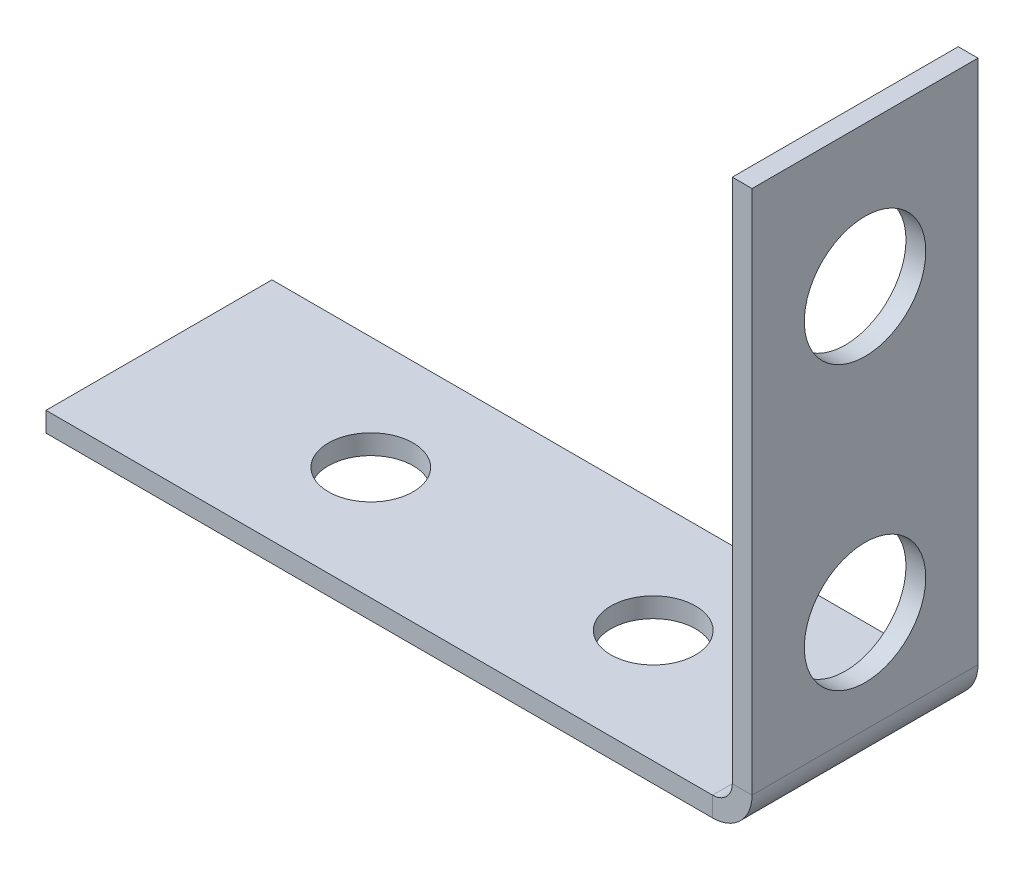
ISO-10303-21;
HEADER;
FILE_DESCRIPTION(('STEP AP214'),'2;1');
FILE_NAME('part.step','',(''),(''),'','','');
FILE_SCHEMA(('AUTOMOTIVE_DESIGN { 1 0 10303 214 1 1 1 1 }'));
ENDSEC;
DATA;
#1=APPLICATION_CONTEXT('core data for automotive mechanical design processes');
#2=APPLICATION_PROTOCOL_DEFINITION('international standard','automotive_design',2000,#1);
#3=PRODUCT_CONTEXT('',#1,'mechanical');
#4=PRODUCT('Part','Part','',(#3));
#5=PRODUCT_RELATED_PRODUCT_CATEGORY('part','',(#4));
#6=PRODUCT_DEFINITION_FORMATION('','',#4);
#7=PRODUCT_DEFINITION_CONTEXT('part definition',#1,'design');
#8=PRODUCT_DEFINITION('design','',#6,#7);
#9=PRODUCT_DEFINITION_SHAPE('','',#8);
#10=(LENGTH_UNIT() NAMED_UNIT(*) SI_UNIT(.MILLI.,.METRE.));
#11=(NAMED_UNIT(*) PLANE_ANGLE_UNIT() SI_UNIT($,.RADIAN.));
#12=(NAMED_UNIT(*) SI_UNIT($,.STERADIAN.) SOLID_ANGLE_UNIT());
#13=UNCERTAINTY_MEASURE_WITH_UNIT(LENGTH_MEASURE(1.E-05),#10,'distance_accuracy_value','');
#14=(GEOMETRIC_REPRESENTATION_CONTEXT(3) GLOBAL_UNCERTAINTY_ASSIGNED_CONTEXT((#13)) GLOBAL_UNIT_ASSIGNED_CONTEXT((#10,
#11,#12)) REPRESENTATION_CONTEXT('',''));
#15=CARTESIAN_POINT('',(0.,0.,0.));
#16=DIRECTION('',(0.,0.,1.));
#17=DIRECTION('',(1.,0.,0.));
#18=AXIS2_PLACEMENT_3D('',#15,#16,#17);
#19=CARTESIAN_POINT('',(23.6,0.,8.));
#20=DIRECTION('',(0.,0.,1.));
#21=DIRECTION('',(1.,0.,0.));
#22=AXIS2_PLACEMENT_3D('',#19,#20,#21);
#23=PLANE('',#22);
#24=DIRECTION('',(0.,1.,0.));
#25=VECTOR('',#24,1.);
#26=CARTESIAN_POINT('',(23.6,0.,8.));
#27=LINE('',#26,#25);
#28=CARTESIAN_POINT('',(23.6,0.,8.));
#29=VERTEX_POINT('',#28);
#30=CARTESIAN_POINT('',(23.6,0.7,8.));
#31=VERTEX_POINT('',#30);
#32=EDGE_CURVE('E11',#29,#31,#27,.T.);
#33=ORIENTED_EDGE('',*,*,#32,.F.);
#34=CARTESIAN_POINT('',(23.6,1.4,8.));
#35=DIRECTION('',(0.,0.,-1.));
#36=DIRECTION('',(-1.,0.,0.));
#37=AXIS2_PLACEMENT_3D('',#34,#35,#36);
#38=CIRCLE('',#37,1.4);
#39=CARTESIAN_POINT('',(25.,1.4,8.));
#40=VERTEX_POINT('',#39);
#41=EDGE_CURVE('E129',#29,#40,#38,.F.);
#42=ORIENTED_EDGE('',*,*,#41,.T.);
#43=DIRECTION('',(1.,0.,0.));
#44=VECTOR('',#43,1.);
#45=CARTESIAN_POINT('',(24.3,1.4,8.));
#46=LINE('',#45,#44);
#47=CARTESIAN_POINT('',(24.3,1.4,8.));
#48=VERTEX_POINT('',#47);
#49=EDGE_CURVE('E47',#48,#40,#46,.T.);
#50=ORIENTED_EDGE('',*,*,#49,.F.);
#51=CARTESIAN_POINT('',(23.6,1.4,8.));
#52=DIRECTION('',(0.,0.,1.));
#53=DIRECTION('',(1.,0.,0.));
#54=AXIS2_PLACEMENT_3D('',#51,#52,#53);
#55=CIRCLE('',#54,0.7);
#56=EDGE_CURVE('E136',#31,#48,#55,.T.);
#57=ORIENTED_EDGE('',*,*,#56,.F.);
#58=EDGE_LOOP('',(#33,#42,#50,#57));
#59=FACE_BOUND('',#58,.T.);
#60=ADVANCED_FACE('F39',(#59),#23,.T.);
#61=CARTESIAN_POINT('',(24.3,1.4,8.));
#62=DIRECTION('',(0.,0.,1.));
#63=DIRECTION('',(1.,0.,0.));
#64=AXIS2_PLACEMENT_3D('',#61,#62,#63);
#65=PLANE('',#64);
#66=DIRECTION('',(1.,0.,0.));
#67=VECTOR('',#66,1.);
#68=CARTESIAN_POINT('',(0.,0.,8.));
#69=LINE('',#68,#67);
#70=CARTESIAN_POINT('',(0.,0.,8.));
#71=VERTEX_POINT('',#70);
#72=EDGE_CURVE('E124',#71,#29,#69,.T.);
#73=ORIENTED_EDGE('',*,*,#72,.T.);
#74=ORIENTED_EDGE('',*,*,#32,.T.);
#75=DIRECTION('',(1.,0.,0.));
#76=VECTOR('',#75,1.);
#77=CARTESIAN_POINT('',(0.,0.7,8.));
#78=LINE('',#77,#76);
#79=CARTESIAN_POINT('',(0.,0.7,8.));
#80=VERTEX_POINT('',#79);
#81=EDGE_CURVE('E134',#80,#31,#78,.T.);
#82=ORIENTED_EDGE('',*,*,#81,.F.);
#83=DIRECTION('',(0.,1.,0.));
#84=VECTOR('',#83,1.);
#85=CARTESIAN_POINT('',(0.,0.,8.));
#86=LINE('',#85,#84);
#87=EDGE_CURVE('E115',#71,#80,#86,.T.);
#88=ORIENTED_EDGE('',*,*,#87,.F.);
#89=EDGE_LOOP('',(#73,#74,#82,#88));
#90=FACE_BOUND('',#89,.T.);
#91=ADVANCED_FACE('F132',(#90),#65,.T.);
#92=CARTESIAN_POINT('',(25.,1.4,0.));
#93=DIRECTION('',(0.,0.,-1.));
#94=DIRECTION('',(-1.,0.,0.));
#95=AXIS2_PLACEMENT_3D('',#92,#93,#94);
#96=PLANE('',#95);
#97=DIRECTION('',(-1.,0.,0.));
#98=VECTOR('',#97,1.);
#99=CARTESIAN_POINT('',(25.,1.4,0.));
#100=LINE('',#99,#98);
#101=CARTESIAN_POINT('',(25.,1.4,0.));
#102=VERTEX_POINT('',#101);
#103=CARTESIAN_POINT('',(24.3,1.4,0.));
#104=VERTEX_POINT('',#103);
#105=EDGE_CURVE('E90',#102,#104,#100,.T.);
#106=ORIENTED_EDGE('',*,*,#105,.F.);
#107=CARTESIAN_POINT('',(23.6,1.4,0.));
#108=DIRECTION('',(0.,0.,-1.));
#109=DIRECTION('',(-1.,0.,0.));
#110=AXIS2_PLACEMENT_3D('',#107,#108,#109);
#111=CIRCLE('',#110,1.4);
#112=CARTESIAN_POINT('',(23.6,0.,0.));
#113=VERTEX_POINT('',#112);
#114=EDGE_CURVE('E159',#113,#102,#111,.F.);
#115=ORIENTED_EDGE('',*,*,#114,.F.);
#116=DIRECTION('',(0.,-1.,0.));
#117=VECTOR('',#116,1.);
#118=CARTESIAN_POINT('',(23.6,0.7,0.));
#119=LINE('',#118,#117);
#120=CARTESIAN_POINT('',(23.6,0.7,0.));
#121=VERTEX_POINT('',#120);
#122=EDGE_CURVE('E83',#121,#113,#119,.T.);
#123=ORIENTED_EDGE('',*,*,#122,.F.);
#124=CARTESIAN_POINT('',(23.6,1.4,0.));
#125=DIRECTION('',(0.,0.,1.));
#126=DIRECTION('',(1.,0.,0.));
#127=AXIS2_PLACEMENT_3D('',#124,#125,#126);
#128=CIRCLE('',#127,0.7);
#129=EDGE_CURVE('E152',#121,#104,#128,.T.);
#130=ORIENTED_EDGE('',*,*,#129,.T.);
#131=EDGE_LOOP('',(#106,#115,#123,#130));
#132=FACE_BOUND('',#131,.T.);
#133=ADVANCED_FACE('F191',(#132),#96,.T.);
#134=CARTESIAN_POINT('',(23.6,0.7,0.));
#135=DIRECTION('',(0.,0.,-1.));
#136=DIRECTION('',(-1.,0.,0.));
#137=AXIS2_PLACEMENT_3D('',#134,#135,#136);
#138=PLANE('',#137);
#139=DIRECTION('',(0.,1.,0.));
#140=VECTOR('',#139,1.);
#141=CARTESIAN_POINT('',(25.,0.,0.));
#142=LINE('',#141,#140);
#143=CARTESIAN_POINT('',(25.,20.,0.));
#144=VERTEX_POINT('',#143);
#145=EDGE_CURVE('E142',#102,#144,#142,.T.);
#146=ORIENTED_EDGE('',*,*,#145,.F.);
#147=ORIENTED_EDGE('',*,*,#105,.T.);
#148=DIRECTION('',(0.,1.,0.));
#149=VECTOR('',#148,1.);
#150=CARTESIAN_POINT('',(24.3,0.,0.));
#151=LINE('',#150,#149);
#152=CARTESIAN_POINT('',(24.3,20.,0.));
#153=VERTEX_POINT('',#152);
#154=EDGE_CURVE('E149',#104,#153,#151,.T.);
#155=ORIENTED_EDGE('',*,*,#154,.T.);
#156=DIRECTION('',(1.,0.,0.));
#157=VECTOR('',#156,1.);
#158=CARTESIAN_POINT('',(24.3,20.,0.));
#159=LINE('',#158,#157);
#160=EDGE_CURVE('E145',#153,#144,#159,.T.);
#161=ORIENTED_EDGE('',*,*,#160,.T.);
#162=EDGE_LOOP('',(#146,#147,#155,#161));
#163=FACE_BOUND('',#162,.T.);
#164=ADVANCED_FACE('F178',(#163),#138,.T.);
#165=CARTESIAN_POINT('',(25.,0.,8.));
#166=DIRECTION('',(-1.,0.,0.));
#167=DIRECTION('',(0.,0.,1.));
#168=AXIS2_PLACEMENT_3D('',#165,#166,#167);
#169=PLANE('',#168);
#170=CARTESIAN_POINT('',(25.,15.,4.));
#171=DIRECTION('',(1.,0.,0.));
#172=DIRECTION('',(0.,0.,-1.));
#173=AXIS2_PLACEMENT_3D('',#170,#171,#172);
#174=CIRCLE('',#173,2.15);
#175=CARTESIAN_POINT('',(25.,15.,1.85));
#176=VERTEX_POINT('',#175);
#177=EDGE_CURVE('E218',#176,#176,#174,.T.);
#178=ORIENTED_EDGE('',*,*,#177,.F.);
#179=EDGE_LOOP('',(#178));
#180=FACE_BOUND('',#179,.T.);
#181=CARTESIAN_POINT('',(25.,5.,4.));
#182=DIRECTION('',(1.,0.,0.));
#183=DIRECTION('',(0.,0.,-1.));
#184=AXIS2_PLACEMENT_3D('',#181,#182,#183);
#185=CIRCLE('',#184,2.15);
#186=CARTESIAN_POINT('',(25.,5.,1.85));
#187=VERTEX_POINT('',#186);
#188=EDGE_CURVE('E219',#187,#187,#185,.T.);
#189=ORIENTED_EDGE('',*,*,#188,.F.);
#190=EDGE_LOOP('',(#189));
#191=FACE_BOUND('',#190,.T.);
#192=ORIENTED_EDGE('',*,*,#145,.T.);
#193=DIRECTION('',(0.,0.,-1.));
#194=VECTOR('',#193,1.);
#195=CARTESIAN_POINT('',(25.,20.,8.));
#196=LINE('',#195,#194);
#197=CARTESIAN_POINT('',(25.,20.,8.));
#198=VERTEX_POINT('',#197);
#199=EDGE_CURVE('E173',#198,#144,#196,.T.);
#200=ORIENTED_EDGE('',*,*,#199,.F.);
#201=DIRECTION('',(0.,1.,0.));
#202=VECTOR('',#201,1.);
#203=CARTESIAN_POINT('',(25.,0.,8.));
#204=LINE('',#203,#202);
#205=EDGE_CURVE('E96',#40,#198,#204,.T.);
#206=ORIENTED_EDGE('',*,*,#205,.F.);
#207=DIRECTION('',(0.,0.,-1.));
#208=VECTOR('',#207,1.);
#209=CARTESIAN_POINT('',(25.,1.4,8.));
#210=LINE('',#209,#208);
#211=EDGE_CURVE('E141',#40,#102,#210,.T.);
#212=ORIENTED_EDGE('',*,*,#211,.T.);
#213=EDGE_LOOP('',(#192,#200,#206,#212));
#214=FACE_BOUND('',#213,.T.);
#215=ADVANCED_FACE('F230',(#180,#191,#214),#169,.F.);
#216=CARTESIAN_POINT('',(24.3,20.,8.));
#217=DIRECTION('',(0.,1.,0.));
#218=DIRECTION('',(0.,0.,1.));
#219=AXIS2_PLACEMENT_3D('',#216,#217,#218);
#220=PLANE('',#219);
#221=ORIENTED_EDGE('',*,*,#160,.F.);
#222=DIRECTION('',(0.,0.,-1.));
#223=VECTOR('',#222,1.);
#224=CARTESIAN_POINT('',(24.3,20.,8.));
#225=LINE('',#224,#223);
#226=CARTESIAN_POINT('',(24.3,20.,8.));
#227=VERTEX_POINT('',#226);
#228=EDGE_CURVE('E171',#227,#153,#225,.T.);
#229=ORIENTED_EDGE('',*,*,#228,.F.);
#230=DIRECTION('',(1.,0.,0.));
#231=VECTOR('',#230,1.);
#232=CARTESIAN_POINT('',(24.3,20.,8.));
#233=LINE('',#232,#231);
#234=EDGE_CURVE('E197',#227,#198,#233,.T.);
#235=ORIENTED_EDGE('',*,*,#234,.T.);
#236=ORIENTED_EDGE('',*,*,#199,.T.);
#237=EDGE_LOOP('',(#221,#229,#235,#236));
#238=FACE_BOUND('',#237,.T.);
#239=ADVANCED_FACE('F233',(#238),#220,.T.);
#240=CARTESIAN_POINT('',(24.3,0.,8.));
#241=DIRECTION('',(-1.,0.,0.));
#242=DIRECTION('',(0.,0.,1.));
#243=AXIS2_PLACEMENT_3D('',#240,#241,#242);
#244=PLANE('',#243);
#245=CARTESIAN_POINT('',(24.3,15.,4.));
#246=DIRECTION('',(-1.,0.,0.));
#247=DIRECTION('',(0.,0.,1.));
#248=AXIS2_PLACEMENT_3D('',#245,#246,#247);
#249=CIRCLE('',#248,2.15);
#250=CARTESIAN_POINT('',(24.3,15.,6.15));
#251=VERTEX_POINT('',#250);
#252=EDGE_CURVE('E210',#251,#251,#249,.F.);
#253=ORIENTED_EDGE('',*,*,#252,.T.);
#254=EDGE_LOOP('',(#253));
#255=FACE_BOUND('',#254,.T.);
#256=CARTESIAN_POINT('',(24.3,5.,4.));
#257=DIRECTION('',(-1.,0.,0.));
#258=DIRECTION('',(0.,0.,1.));
#259=AXIS2_PLACEMENT_3D('',#256,#257,#258);
#260=CIRCLE('',#259,2.15);
#261=CARTESIAN_POINT('',(24.3,5.,6.15));
#262=VERTEX_POINT('',#261);
#263=EDGE_CURVE('E215',#262,#262,#260,.F.);
#264=ORIENTED_EDGE('',*,*,#263,.T.);
#265=EDGE_LOOP('',(#264));
#266=FACE_BOUND('',#265,.T.);
#267=ORIENTED_EDGE('',*,*,#154,.F.);
#268=DIRECTION('',(0.,0.,-1.));
#269=VECTOR('',#268,1.);
#270=CARTESIAN_POINT('',(24.3,1.4,8.));
#271=LINE('',#270,#269);
#272=EDGE_CURVE('E168',#48,#104,#271,.T.);
#273=ORIENTED_EDGE('',*,*,#272,.F.);
#274=DIRECTION('',(0.,1.,0.));
#275=VECTOR('',#274,1.);
#276=CARTESIAN_POINT('',(24.3,0.,8.));
#277=LINE('',#276,#275);
#278=EDGE_CURVE('E196',#48,#227,#277,.T.);
#279=ORIENTED_EDGE('',*,*,#278,.T.);
#280=ORIENTED_EDGE('',*,*,#228,.T.);
#281=EDGE_LOOP('',(#267,#273,#279,#280));
#282=FACE_BOUND('',#281,.T.);
#283=ADVANCED_FACE('F189',(#255,#266,#282),#244,.T.);
#284=CARTESIAN_POINT('',(23.6,1.4,8.));
#285=DIRECTION('',(0.,0.,-1.));
#286=DIRECTION('',(-1.,0.,0.));
#287=AXIS2_PLACEMENT_3D('',#284,#285,#286);
#288=CYLINDRICAL_SURFACE('',#287,0.7);
#289=ORIENTED_EDGE('',*,*,#129,.F.);
#290=DIRECTION('',(0.,0.,-1.));
#291=VECTOR('',#290,1.);
#292=CARTESIAN_POINT('',(23.6,0.7,8.));
#293=LINE('',#292,#291);
#294=EDGE_CURVE('E165',#31,#121,#293,.T.);
#295=ORIENTED_EDGE('',*,*,#294,.F.);
#296=ORIENTED_EDGE('',*,*,#56,.T.);
#297=ORIENTED_EDGE('',*,*,#272,.T.);
#298=EDGE_LOOP('',(#289,#295,#296,#297));
#299=FACE_BOUND('',#298,.T.);
#300=ADVANCED_FACE('F184',(#299),#288,.F.);
#301=CARTESIAN_POINT('',(0.,0.7,8.));
#302=DIRECTION('',(0.,1.,0.));
#303=DIRECTION('',(0.,0.,1.));
#304=AXIS2_PLACEMENT_3D('',#301,#302,#303);
#305=PLANE('',#304);
#306=CARTESIAN_POINT('',(7.5,0.7,4.));
#307=DIRECTION('',(0.,1.,0.));
#308=DIRECTION('',(0.,0.,1.));
#309=AXIS2_PLACEMENT_3D('',#306,#307,#308);
#310=CIRCLE('',#309,1.5);
#311=CARTESIAN_POINT('',(7.5,0.7,5.5));
#312=VERTEX_POINT('',#311);
#313=EDGE_CURVE('E206',#312,#312,#310,.T.);
#314=ORIENTED_EDGE('',*,*,#313,.F.);
#315=EDGE_LOOP('',(#314));
#316=FACE_BOUND('',#315,.T.);
#317=CARTESIAN_POINT('',(17.5,0.7,4.));
#318=DIRECTION('',(0.,1.,0.));
#319=DIRECTION('',(0.,0.,1.));
#320=AXIS2_PLACEMENT_3D('',#317,#318,#319);
#321=CIRCLE('',#320,1.5);
#322=CARTESIAN_POINT('',(17.5,0.7,5.5));
#323=VERTEX_POINT('',#322);
#324=EDGE_CURVE('E207',#323,#323,#321,.T.);
#325=ORIENTED_EDGE('',*,*,#324,.F.);
#326=EDGE_LOOP('',(#325));
#327=FACE_BOUND('',#326,.T.);
#328=DIRECTION('',(1.,0.,0.));
#329=VECTOR('',#328,1.);
#330=CARTESIAN_POINT('',(0.,0.7,0.));
#331=LINE('',#330,#329);
#332=CARTESIAN_POINT('',(0.,0.7,0.));
#333=VERTEX_POINT('',#332);
#334=EDGE_CURVE('E154',#333,#121,#331,.T.);
#335=ORIENTED_EDGE('',*,*,#334,.F.);
#336=DIRECTION('',(0.,0.,-1.));
#337=VECTOR('',#336,1.);
#338=CARTESIAN_POINT('',(0.,0.7,8.));
#339=LINE('',#338,#337);
#340=EDGE_CURVE('E119',#80,#333,#339,.T.);
#341=ORIENTED_EDGE('',*,*,#340,.F.);
#342=ORIENTED_EDGE('',*,*,#81,.T.);
#343=ORIENTED_EDGE('',*,*,#294,.T.);
#344=EDGE_LOOP('',(#335,#341,#342,#343));
#345=FACE_BOUND('',#344,.T.);
#346=ADVANCED_FACE('F194',(#316,#327,#345),#305,.T.);
#347=CARTESIAN_POINT('',(0.,0.,8.));
#348=DIRECTION('',(-1.,0.,0.));
#349=DIRECTION('',(0.,0.,1.));
#350=AXIS2_PLACEMENT_3D('',#347,#348,#349);
#351=PLANE('',#350);
#352=DIRECTION('',(0.,1.,0.));
#353=VECTOR('',#352,1.);
#354=CARTESIAN_POINT('',(0.,0.,0.));
#355=LINE('',#354,#353);
#356=CARTESIAN_POINT('',(0.,0.,0.));
#357=VERTEX_POINT('',#356);
#358=EDGE_CURVE('E117',#357,#333,#355,.T.);
#359=ORIENTED_EDGE('',*,*,#358,.F.);
#360=DIRECTION('',(0.,0.,-1.));
#361=VECTOR('',#360,1.);
#362=CARTESIAN_POINT('',(0.,0.,8.));
#363=LINE('',#362,#361);
#364=EDGE_CURVE('E111',#71,#357,#363,.T.);
#365=ORIENTED_EDGE('',*,*,#364,.F.);
#366=ORIENTED_EDGE('',*,*,#87,.T.);
#367=ORIENTED_EDGE('',*,*,#340,.T.);
#368=EDGE_LOOP('',(#359,#365,#366,#367));
#369=FACE_BOUND('',#368,.T.);
#370=ADVANCED_FACE('F113',(#369),#351,.T.);
#371=CARTESIAN_POINT('',(0.,0.,8.));
#372=DIRECTION('',(0.,1.,0.));
#373=DIRECTION('',(0.,0.,1.));
#374=AXIS2_PLACEMENT_3D('',#371,#372,#373);
#375=PLANE('',#374);
#376=CARTESIAN_POINT('',(7.5,0.,4.));
#377=DIRECTION('',(0.,1.,0.));
#378=DIRECTION('',(0.,0.,1.));
#379=AXIS2_PLACEMENT_3D('',#376,#377,#378);
#380=CIRCLE('',#379,1.5);
#381=CARTESIAN_POINT('',(7.5,0.,5.5));
#382=VERTEX_POINT('',#381);
#383=EDGE_CURVE('E146',#382,#382,#380,.F.);
#384=ORIENTED_EDGE('',*,*,#383,.F.);
#385=EDGE_LOOP('',(#384));
#386=FACE_BOUND('',#385,.T.);
#387=CARTESIAN_POINT('',(17.5,0.,4.));
#388=DIRECTION('',(0.,1.,0.));
#389=DIRECTION('',(0.,0.,1.));
#390=AXIS2_PLACEMENT_3D('',#387,#388,#389);
#391=CIRCLE('',#390,1.5);
#392=CARTESIAN_POINT('',(17.5,0.,5.5));
#393=VERTEX_POINT('',#392);
#394=EDGE_CURVE('E203',#393,#393,#391,.F.);
#395=ORIENTED_EDGE('',*,*,#394,.F.);
#396=EDGE_LOOP('',(#395));
#397=FACE_BOUND('',#396,.T.);
#398=DIRECTION('',(1.,0.,0.));
#399=VECTOR('',#398,1.);
#400=CARTESIAN_POINT('',(0.,0.,0.));
#401=LINE('',#400,#399);
#402=EDGE_CURVE('E157',#357,#113,#401,.T.);
#403=ORIENTED_EDGE('',*,*,#402,.T.);
#404=DIRECTION('',(0.,0.,-1.));
#405=VECTOR('',#404,1.);
#406=CARTESIAN_POINT('',(23.6,0.,8.));
#407=LINE('',#406,#405);
#408=EDGE_CURVE('E120',#29,#113,#407,.T.);
#409=ORIENTED_EDGE('',*,*,#408,.F.);
#410=ORIENTED_EDGE('',*,*,#72,.F.);
#411=ORIENTED_EDGE('',*,*,#364,.T.);
#412=EDGE_LOOP('',(#403,#409,#410,#411));
#413=FACE_BOUND('',#412,.T.);
#414=ADVANCED_FACE('F125',(#386,#397,#413),#375,.F.);
#415=CARTESIAN_POINT('',(23.6,1.4,8.));
#416=DIRECTION('',(0.,0.,-1.));
#417=DIRECTION('',(-1.,0.,0.));
#418=AXIS2_PLACEMENT_3D('',#415,#416,#417);
#419=CYLINDRICAL_SURFACE('',#418,1.4);
#420=ORIENTED_EDGE('',*,*,#114,.T.);
#421=ORIENTED_EDGE('',*,*,#211,.F.);
#422=ORIENTED_EDGE('',*,*,#41,.F.);
#423=ORIENTED_EDGE('',*,*,#408,.T.);
#424=EDGE_LOOP('',(#420,#421,#422,#423));
#425=FACE_BOUND('',#424,.T.);
#426=ADVANCED_FACE('F242',(#425),#419,.T.);
#427=CARTESIAN_POINT('',(23.6,1.4,8.));
#428=DIRECTION('',(0.,0.,1.));
#429=DIRECTION('',(1.,0.,0.));
#430=AXIS2_PLACEMENT_3D('',#427,#428,#429);
#431=PLANE('',#430);
#432=ORIENTED_EDGE('',*,*,#205,.T.);
#433=ORIENTED_EDGE('',*,*,#234,.F.);
#434=ORIENTED_EDGE('',*,*,#278,.F.);
#435=ORIENTED_EDGE('',*,*,#49,.T.);
#436=EDGE_LOOP('',(#432,#433,#434,#435));
#437=FACE_BOUND('',#436,.T.);
#438=ADVANCED_FACE('F239',(#437),#431,.T.);
#439=CARTESIAN_POINT('',(23.6,1.4,0.));
#440=DIRECTION('',(0.,0.,1.));
#441=DIRECTION('',(1.,0.,0.));
#442=AXIS2_PLACEMENT_3D('',#439,#440,#441);
#443=PLANE('',#442);
#444=ORIENTED_EDGE('',*,*,#334,.T.);
#445=ORIENTED_EDGE('',*,*,#122,.T.);
#446=ORIENTED_EDGE('',*,*,#402,.F.);
#447=ORIENTED_EDGE('',*,*,#358,.T.);
#448=EDGE_LOOP('',(#444,#445,#446,#447));
#449=FACE_BOUND('',#448,.T.);
#450=ADVANCED_FACE('F241',(#449),#443,.F.);
#451=CARTESIAN_POINT('',(17.5,-4.24264068711929,4.));
#452=DIRECTION('',(0.,1.,0.));
#453=DIRECTION('',(0.,0.,1.));
#454=AXIS2_PLACEMENT_3D('',#451,#452,#453);
#455=CYLINDRICAL_SURFACE('',#454,1.5);
#456=ORIENTED_EDGE('',*,*,#394,.T.);
#457=EDGE_LOOP('',(#456));
#458=FACE_BOUND('',#457,.T.);
#459=ORIENTED_EDGE('',*,*,#324,.T.);
#460=EDGE_LOOP('',(#459));
#461=FACE_BOUND('',#460,.T.);
#462=ADVANCED_FACE('F248',(#458,#461),#455,.F.);
#463=CARTESIAN_POINT('',(7.5,-4.24264068711929,4.));
#464=DIRECTION('',(0.,1.,0.));
#465=DIRECTION('',(0.,0.,1.));
#466=AXIS2_PLACEMENT_3D('',#463,#464,#465);
#467=CYLINDRICAL_SURFACE('',#466,1.5);
#468=ORIENTED_EDGE('',*,*,#383,.T.);
#469=EDGE_LOOP('',(#468));
#470=FACE_BOUND('',#469,.T.);
#471=ORIENTED_EDGE('',*,*,#313,.T.);
#472=EDGE_LOOP('',(#471));
#473=FACE_BOUND('',#472,.T.);
#474=ADVANCED_FACE('F286',(#470,#473),#467,.F.);
#475=CARTESIAN_POINT('',(18.2188816817957,5.,4.));
#476=DIRECTION('',(1.,0.,0.));
#477=DIRECTION('',(0.,0.,-1.));
#478=AXIS2_PLACEMENT_3D('',#475,#476,#477);
#479=CYLINDRICAL_SURFACE('',#478,2.15);
#480=ORIENTED_EDGE('',*,*,#188,.T.);
#481=EDGE_LOOP('',(#480));
#482=FACE_BOUND('',#481,.T.);
#483=ORIENTED_EDGE('',*,*,#263,.F.);
#484=EDGE_LOOP('',(#483));
#485=FACE_BOUND('',#484,.T.);
#486=ADVANCED_FACE('F292',(#482,#485),#479,.F.);
#487=CARTESIAN_POINT('',(18.2188816817957,15.,4.));
#488=DIRECTION('',(1.,0.,0.));
#489=DIRECTION('',(0.,0.,-1.));
#490=AXIS2_PLACEMENT_3D('',#487,#488,#489);
#491=CYLINDRICAL_SURFACE('',#490,2.15);
#492=ORIENTED_EDGE('',*,*,#177,.T.);
#493=EDGE_LOOP('',(#492));
#494=FACE_BOUND('',#493,.T.);
#495=ORIENTED_EDGE('',*,*,#252,.F.);
#496=EDGE_LOOP('',(#495));
#497=FACE_BOUND('',#496,.T.);
#498=ADVANCED_FACE('F227',(#494,#497),#491,.F.);
#499=CLOSED_SHELL('',(#60,#91,#133,#164,#215,#239,#283,#300,#346,#370,#414,#426,#438,#450,#462,
#474,#486,#498));
#500=MANIFOLD_SOLID_BREP('B2',#499);
#501=ADVANCED_BREP_SHAPE_REPRESENTATION('',(#18,#500),#14);
#502=SHAPE_DEFINITION_REPRESENTATION(#9,#501);
ENDSEC;
END-ISO-10303-21;
